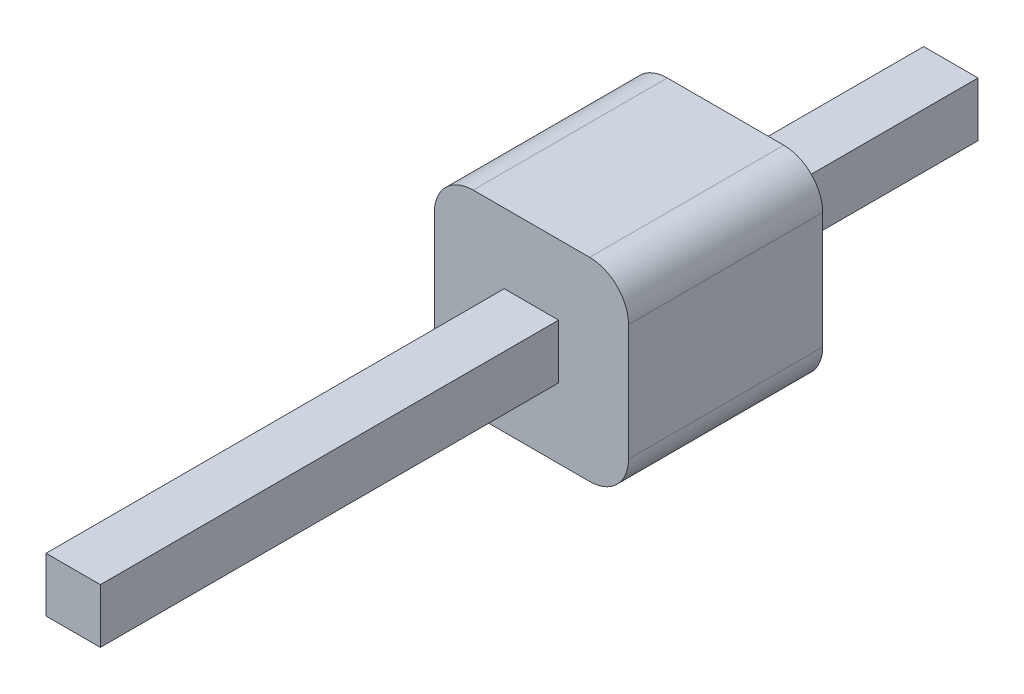
ISO-10303-21;
HEADER;
FILE_DESCRIPTION(('STEP AP214'),'2;1');
FILE_NAME('part.step','',(''),(''),'','','');
FILE_SCHEMA(('AUTOMOTIVE_DESIGN { 1 0 10303 214 1 1 1 1 }'));
ENDSEC;
DATA;
#1=APPLICATION_CONTEXT('core data for automotive mechanical design processes');
#2=APPLICATION_PROTOCOL_DEFINITION('international standard','automotive_design',2000,#1);
#3=PRODUCT_CONTEXT('',#1,'mechanical');
#4=PRODUCT('Part','Part','',(#3));
#5=PRODUCT_RELATED_PRODUCT_CATEGORY('part','',(#4));
#6=PRODUCT_DEFINITION_FORMATION('','',#4);
#7=PRODUCT_DEFINITION_CONTEXT('part definition',#1,'design');
#8=PRODUCT_DEFINITION('design','',#6,#7);
#9=PRODUCT_DEFINITION_SHAPE('','',#8);
#10=(LENGTH_UNIT() NAMED_UNIT(*) SI_UNIT(.MILLI.,.METRE.));
#11=(NAMED_UNIT(*) PLANE_ANGLE_UNIT() SI_UNIT($,.RADIAN.));
#12=(NAMED_UNIT(*) SI_UNIT($,.STERADIAN.) SOLID_ANGLE_UNIT());
#13=UNCERTAINTY_MEASURE_WITH_UNIT(LENGTH_MEASURE(1.E-05),#10,'distance_accuracy_value','');
#14=(GEOMETRIC_REPRESENTATION_CONTEXT(3) GLOBAL_UNCERTAINTY_ASSIGNED_CONTEXT((#13)) GLOBAL_UNIT_ASSIGNED_CONTEXT((#10,
#11,#12)) REPRESENTATION_CONTEXT('',''));
#15=CARTESIAN_POINT('',(0.,0.,0.));
#16=DIRECTION('',(0.,0.,1.));
#17=DIRECTION('',(1.,0.,0.));
#18=AXIS2_PLACEMENT_3D('',#15,#16,#17);
#19=CARTESIAN_POINT('',(-0.35,-0.35,11.3));
#20=DIRECTION('',(1.,0.,0.));
#21=DIRECTION('',(0.,0.,-1.));
#22=AXIS2_PLACEMENT_3D('',#19,#20,#21);
#23=PLANE('',#22);
#24=DIRECTION('',(0.,1.,0.));
#25=VECTOR('',#24,1.);
#26=CARTESIAN_POINT('',(-0.35,-0.35,5.4));
#27=LINE('',#26,#25);
#28=CARTESIAN_POINT('',(-0.35,-0.35,5.4));
#29=VERTEX_POINT('',#28);
#30=CARTESIAN_POINT('',(-0.35,0.35,5.4));
#31=VERTEX_POINT('',#30);
#32=EDGE_CURVE('E259',#29,#31,#27,.T.);
#33=ORIENTED_EDGE('',*,*,#32,.F.);
#34=DIRECTION('',(0.,0.,-1.));
#35=VECTOR('',#34,1.);
#36=CARTESIAN_POINT('',(-0.35,-0.35,11.3));
#37=LINE('',#36,#35);
#38=CARTESIAN_POINT('',(-0.35,-0.35,11.3));
#39=VERTEX_POINT('',#38);
#40=EDGE_CURVE('E160',#39,#29,#37,.T.);
#41=ORIENTED_EDGE('',*,*,#40,.F.);
#42=DIRECTION('',(0.,-1.,0.));
#43=VECTOR('',#42,1.);
#44=CARTESIAN_POINT('',(-0.35,-0.35,11.3));
#45=LINE('',#44,#43);
#46=CARTESIAN_POINT('',(-0.35,0.35,11.3));
#47=VERTEX_POINT('',#46);
#48=EDGE_CURVE('E263',#47,#39,#45,.T.);
#49=ORIENTED_EDGE('',*,*,#48,.F.);
#50=DIRECTION('',(0.,0.,-1.));
#51=VECTOR('',#50,1.);
#52=CARTESIAN_POINT('',(-0.35,0.35,11.3));
#53=LINE('',#52,#51);
#54=EDGE_CURVE('E176',#47,#31,#53,.T.);
#55=ORIENTED_EDGE('',*,*,#54,.T.);
#56=EDGE_LOOP('',(#33,#41,#49,#55));
#57=FACE_BOUND('',#56,.T.);
#58=ADVANCED_FACE('F36',(#57),#23,.F.);
#59=CARTESIAN_POINT('',(0.35,-0.35,11.3));
#60=DIRECTION('',(0.,1.,0.));
#61=DIRECTION('',(-1.,0.,0.));
#62=AXIS2_PLACEMENT_3D('',#59,#60,#61);
#63=PLANE('',#62);
#64=DIRECTION('',(-1.,0.,0.));
#65=VECTOR('',#64,1.);
#66=CARTESIAN_POINT('',(0.35,-0.35,5.4));
#67=LINE('',#66,#65);
#68=CARTESIAN_POINT('',(0.35,-0.35,5.4));
#69=VERTEX_POINT('',#68);
#70=EDGE_CURVE('E256',#69,#29,#67,.T.);
#71=ORIENTED_EDGE('',*,*,#70,.F.);
#72=DIRECTION('',(0.,0.,-1.));
#73=VECTOR('',#72,1.);
#74=CARTESIAN_POINT('',(0.35,-0.35,11.3));
#75=LINE('',#74,#73);
#76=CARTESIAN_POINT('',(0.35,-0.35,11.3));
#77=VERTEX_POINT('',#76);
#78=EDGE_CURVE('E189',#77,#69,#75,.T.);
#79=ORIENTED_EDGE('',*,*,#78,.F.);
#80=DIRECTION('',(1.,0.,0.));
#81=VECTOR('',#80,1.);
#82=CARTESIAN_POINT('',(0.35,-0.35,11.3));
#83=LINE('',#82,#81);
#84=EDGE_CURVE('E266',#39,#77,#83,.T.);
#85=ORIENTED_EDGE('',*,*,#84,.F.);
#86=ORIENTED_EDGE('',*,*,#40,.T.);
#87=EDGE_LOOP('',(#71,#79,#85,#86));
#88=FACE_BOUND('',#87,.T.);
#89=ADVANCED_FACE('F285',(#88),#63,.F.);
#90=CARTESIAN_POINT('',(0.35,-0.35,11.3));
#91=DIRECTION('',(-1.,0.,0.));
#92=DIRECTION('',(0.,0.,1.));
#93=AXIS2_PLACEMENT_3D('',#90,#91,#92);
#94=PLANE('',#93);
#95=DIRECTION('',(0.,-1.,0.));
#96=VECTOR('',#95,1.);
#97=CARTESIAN_POINT('',(0.35,-0.35,5.4));
#98=LINE('',#97,#96);
#99=CARTESIAN_POINT('',(0.35,0.35,5.4));
#100=VERTEX_POINT('',#99);
#101=EDGE_CURVE('E169',#100,#69,#98,.T.);
#102=ORIENTED_EDGE('',*,*,#101,.F.);
#103=DIRECTION('',(0.,0.,-1.));
#104=VECTOR('',#103,1.);
#105=CARTESIAN_POINT('',(0.35,0.35,11.3));
#106=LINE('',#105,#104);
#107=CARTESIAN_POINT('',(0.35,0.35,11.3));
#108=VERTEX_POINT('',#107);
#109=EDGE_CURVE('E186',#108,#100,#106,.T.);
#110=ORIENTED_EDGE('',*,*,#109,.F.);
#111=DIRECTION('',(0.,1.,0.));
#112=VECTOR('',#111,1.);
#113=CARTESIAN_POINT('',(0.35,-0.35,11.3));
#114=LINE('',#113,#112);
#115=EDGE_CURVE('E181',#77,#108,#114,.T.);
#116=ORIENTED_EDGE('',*,*,#115,.F.);
#117=ORIENTED_EDGE('',*,*,#78,.T.);
#118=EDGE_LOOP('',(#102,#110,#116,#117));
#119=FACE_BOUND('',#118,.T.);
#120=ADVANCED_FACE('F293',(#119),#94,.F.);
#121=CARTESIAN_POINT('',(0.35,0.35,11.3));
#122=DIRECTION('',(0.,-1.,0.));
#123=DIRECTION('',(1.,0.,0.));
#124=AXIS2_PLACEMENT_3D('',#121,#122,#123);
#125=PLANE('',#124);
#126=DIRECTION('',(1.,0.,0.));
#127=VECTOR('',#126,1.);
#128=CARTESIAN_POINT('',(0.35,0.35,5.4));
#129=LINE('',#128,#127);
#130=EDGE_CURVE('E159',#31,#100,#129,.T.);
#131=ORIENTED_EDGE('',*,*,#130,.F.);
#132=ORIENTED_EDGE('',*,*,#54,.F.);
#133=DIRECTION('',(-1.,0.,0.));
#134=VECTOR('',#133,1.);
#135=CARTESIAN_POINT('',(0.35,0.35,11.3));
#136=LINE('',#135,#134);
#137=EDGE_CURVE('E177',#108,#47,#136,.T.);
#138=ORIENTED_EDGE('',*,*,#137,.F.);
#139=ORIENTED_EDGE('',*,*,#109,.T.);
#140=EDGE_LOOP('',(#131,#132,#138,#139));
#141=FACE_BOUND('',#140,.T.);
#142=ADVANCED_FACE('F350',(#141),#125,.F.);
#143=CARTESIAN_POINT('',(0.,0.,11.3));
#144=DIRECTION('',(0.,0.,1.));
#145=DIRECTION('',(1.,0.,0.));
#146=AXIS2_PLACEMENT_3D('',#143,#144,#145);
#147=PLANE('',#146);
#148=ORIENTED_EDGE('',*,*,#48,.T.);
#149=ORIENTED_EDGE('',*,*,#84,.T.);
#150=ORIENTED_EDGE('',*,*,#115,.T.);
#151=ORIENTED_EDGE('',*,*,#137,.T.);
#152=EDGE_LOOP('',(#148,#149,#150,#151));
#153=FACE_BOUND('',#152,.T.);
#154=ADVANCED_FACE('F337',(#153),#147,.T.);
#155=CARTESIAN_POINT('',(0.,0.,5.4));
#156=DIRECTION('',(0.,0.,-1.));
#157=DIRECTION('',(-1.,0.,0.));
#158=AXIS2_PLACEMENT_3D('',#155,#156,#157);
#159=PLANE('',#158);
#160=DIRECTION('',(0.,1.,0.));
#161=VECTOR('',#160,1.);
#162=CARTESIAN_POINT('',(-1.25,-1.25,5.4));
#163=LINE('',#162,#161);
#164=CARTESIAN_POINT('',(-1.25,-0.75,5.4));
#165=VERTEX_POINT('',#164);
#166=CARTESIAN_POINT('',(-1.25,0.75,5.4));
#167=VERTEX_POINT('',#166);
#168=EDGE_CURVE('E323',#165,#167,#163,.T.);
#169=ORIENTED_EDGE('',*,*,#168,.F.);
#170=CARTESIAN_POINT('',(-0.75,-0.75,5.4));
#171=DIRECTION('',(0.,0.,-1.));
#172=DIRECTION('',(-1.,0.,0.));
#173=AXIS2_PLACEMENT_3D('',#170,#171,#172);
#174=CIRCLE('',#173,0.5);
#175=CARTESIAN_POINT('',(-0.75,-1.25,5.4));
#176=VERTEX_POINT('',#175);
#177=EDGE_CURVE('E219',#165,#176,#174,.F.);
#178=ORIENTED_EDGE('',*,*,#177,.T.);
#179=DIRECTION('',(-1.,0.,0.));
#180=VECTOR('',#179,1.);
#181=CARTESIAN_POINT('',(-1.25,-1.25,5.4));
#182=LINE('',#181,#180);
#183=CARTESIAN_POINT('',(0.75,-1.25,5.4));
#184=VERTEX_POINT('',#183);
#185=EDGE_CURVE('E325',#184,#176,#182,.T.);
#186=ORIENTED_EDGE('',*,*,#185,.F.);
#187=CARTESIAN_POINT('',(0.75,-0.75,5.4));
#188=DIRECTION('',(0.,0.,-1.));
#189=DIRECTION('',(-1.,0.,0.));
#190=AXIS2_PLACEMENT_3D('',#187,#188,#189);
#191=CIRCLE('',#190,0.5);
#192=CARTESIAN_POINT('',(1.25,-0.75,5.4));
#193=VERTEX_POINT('',#192);
#194=EDGE_CURVE('E214',#184,#193,#191,.F.);
#195=ORIENTED_EDGE('',*,*,#194,.T.);
#196=DIRECTION('',(0.,-1.,0.));
#197=VECTOR('',#196,1.);
#198=CARTESIAN_POINT('',(1.25,-1.25,5.4));
#199=LINE('',#198,#197);
#200=CARTESIAN_POINT('',(1.25,0.75,5.4));
#201=VERTEX_POINT('',#200);
#202=EDGE_CURVE('E233',#201,#193,#199,.T.);
#203=ORIENTED_EDGE('',*,*,#202,.F.);
#204=CARTESIAN_POINT('',(0.75,0.75,5.4));
#205=DIRECTION('',(0.,0.,-1.));
#206=DIRECTION('',(-1.,0.,0.));
#207=AXIS2_PLACEMENT_3D('',#204,#205,#206);
#208=CIRCLE('',#207,0.5);
#209=CARTESIAN_POINT('',(0.75,1.25,5.4));
#210=VERTEX_POINT('',#209);
#211=EDGE_CURVE('E51',#201,#210,#208,.F.);
#212=ORIENTED_EDGE('',*,*,#211,.T.);
#213=DIRECTION('',(1.,0.,0.));
#214=VECTOR('',#213,1.);
#215=CARTESIAN_POINT('',(-1.25,1.25,5.4));
#216=LINE('',#215,#214);
#217=CARTESIAN_POINT('',(-0.75,1.25,5.4));
#218=VERTEX_POINT('',#217);
#219=EDGE_CURVE('E245',#218,#210,#216,.T.);
#220=ORIENTED_EDGE('',*,*,#219,.F.);
#221=CARTESIAN_POINT('',(-0.75,0.75,5.4));
#222=DIRECTION('',(0.,0.,-1.));
#223=DIRECTION('',(-1.,0.,0.));
#224=AXIS2_PLACEMENT_3D('',#221,#222,#223);
#225=CIRCLE('',#224,0.5);
#226=EDGE_CURVE('E217',#218,#167,#225,.F.);
#227=ORIENTED_EDGE('',*,*,#226,.T.);
#228=EDGE_LOOP('',(#169,#178,#186,#195,#203,#212,#220,#227));
#229=FACE_BOUND('',#228,.T.);
#230=ORIENTED_EDGE('',*,*,#70,.T.);
#231=ORIENTED_EDGE('',*,*,#32,.T.);
#232=ORIENTED_EDGE('',*,*,#130,.T.);
#233=ORIENTED_EDGE('',*,*,#101,.T.);
#234=EDGE_LOOP('',(#230,#231,#232,#233));
#235=FACE_BOUND('',#234,.T.);
#236=ADVANCED_FACE('F334',(#229,#235),#159,.F.);
#237=CARTESIAN_POINT('',(0.,0.,2.9));
#238=DIRECTION('',(0.,0.,-1.));
#239=DIRECTION('',(-1.,0.,0.));
#240=AXIS2_PLACEMENT_3D('',#237,#238,#239);
#241=PLANE('',#240);
#242=DIRECTION('',(-1.,0.,0.));
#243=VECTOR('',#242,1.);
#244=CARTESIAN_POINT('',(-1.25,-1.25,2.9));
#245=LINE('',#244,#243);
#246=CARTESIAN_POINT('',(0.75,-1.25,2.9));
#247=VERTEX_POINT('',#246);
#248=CARTESIAN_POINT('',(-0.75,-1.25,2.9));
#249=VERTEX_POINT('',#248);
#250=EDGE_CURVE('E240',#247,#249,#245,.T.);
#251=ORIENTED_EDGE('',*,*,#250,.T.);
#252=CARTESIAN_POINT('',(-0.75,-0.75,2.9));
#253=DIRECTION('',(0.,0.,-1.));
#254=DIRECTION('',(-1.,0.,0.));
#255=AXIS2_PLACEMENT_3D('',#252,#253,#254);
#256=CIRCLE('',#255,0.5);
#257=CARTESIAN_POINT('',(-1.25,-0.75,2.9));
#258=VERTEX_POINT('',#257);
#259=EDGE_CURVE('E207',#249,#258,#256,.T.);
#260=ORIENTED_EDGE('',*,*,#259,.T.);
#261=DIRECTION('',(0.,1.,0.));
#262=VECTOR('',#261,1.);
#263=CARTESIAN_POINT('',(-1.25,-1.25,2.9));
#264=LINE('',#263,#262);
#265=CARTESIAN_POINT('',(-1.25,0.75,2.9));
#266=VERTEX_POINT('',#265);
#267=EDGE_CURVE('E242',#258,#266,#264,.T.);
#268=ORIENTED_EDGE('',*,*,#267,.T.);
#269=CARTESIAN_POINT('',(-0.75,0.75,2.9));
#270=DIRECTION('',(0.,0.,-1.));
#271=DIRECTION('',(-1.,0.,0.));
#272=AXIS2_PLACEMENT_3D('',#269,#270,#271);
#273=CIRCLE('',#272,0.5);
#274=CARTESIAN_POINT('',(-0.75,1.25,2.9));
#275=VERTEX_POINT('',#274);
#276=EDGE_CURVE('E205',#266,#275,#273,.T.);
#277=ORIENTED_EDGE('',*,*,#276,.T.);
#278=DIRECTION('',(1.,0.,0.));
#279=VECTOR('',#278,1.);
#280=CARTESIAN_POINT('',(-1.25,1.25,2.9));
#281=LINE('',#280,#279);
#282=CARTESIAN_POINT('',(0.75,1.25,2.9));
#283=VERTEX_POINT('',#282);
#284=EDGE_CURVE('E250',#275,#283,#281,.T.);
#285=ORIENTED_EDGE('',*,*,#284,.T.);
#286=CARTESIAN_POINT('',(0.75,0.75,2.9));
#287=DIRECTION('',(0.,0.,-1.));
#288=DIRECTION('',(-1.,0.,0.));
#289=AXIS2_PLACEMENT_3D('',#286,#287,#288);
#290=CIRCLE('',#289,0.5);
#291=CARTESIAN_POINT('',(1.25,0.75,2.9));
#292=VERTEX_POINT('',#291);
#293=EDGE_CURVE('E203',#283,#292,#290,.T.);
#294=ORIENTED_EDGE('',*,*,#293,.T.);
#295=DIRECTION('',(0.,-1.,0.));
#296=VECTOR('',#295,1.);
#297=CARTESIAN_POINT('',(1.25,-1.25,2.9));
#298=LINE('',#297,#296);
#299=CARTESIAN_POINT('',(1.25,-0.75,2.9));
#300=VERTEX_POINT('',#299);
#301=EDGE_CURVE('E231',#292,#300,#298,.T.);
#302=ORIENTED_EDGE('',*,*,#301,.T.);
#303=CARTESIAN_POINT('',(0.75,-0.75,2.9));
#304=DIRECTION('',(0.,0.,-1.));
#305=DIRECTION('',(-1.,0.,0.));
#306=AXIS2_PLACEMENT_3D('',#303,#304,#305);
#307=CIRCLE('',#306,0.5);
#308=EDGE_CURVE('E201',#300,#247,#307,.T.);
#309=ORIENTED_EDGE('',*,*,#308,.T.);
#310=EDGE_LOOP('',(#251,#260,#268,#277,#285,#294,#302,#309));
#311=FACE_BOUND('',#310,.T.);
#312=DIRECTION('',(0.,1.,0.));
#313=VECTOR('',#312,1.);
#314=CARTESIAN_POINT('',(-0.35,-0.35,2.9));
#315=LINE('',#314,#313);
#316=CARTESIAN_POINT('',(-0.35,-0.35,2.9));
#317=VERTEX_POINT('',#316);
#318=CARTESIAN_POINT('',(-0.35,0.35,2.9));
#319=VERTEX_POINT('',#318);
#320=EDGE_CURVE('E152',#317,#319,#315,.T.);
#321=ORIENTED_EDGE('',*,*,#320,.F.);
#322=DIRECTION('',(-1.,0.,0.));
#323=VECTOR('',#322,1.);
#324=CARTESIAN_POINT('',(0.35,-0.35,2.9));
#325=LINE('',#324,#323);
#326=CARTESIAN_POINT('',(0.35,-0.35,2.9));
#327=VERTEX_POINT('',#326);
#328=EDGE_CURVE('E170',#327,#317,#325,.T.);
#329=ORIENTED_EDGE('',*,*,#328,.F.);
#330=DIRECTION('',(0.,-1.,0.));
#331=VECTOR('',#330,1.);
#332=CARTESIAN_POINT('',(0.35,-0.35,2.9));
#333=LINE('',#332,#331);
#334=CARTESIAN_POINT('',(0.35,0.35,2.9));
#335=VERTEX_POINT('',#334);
#336=EDGE_CURVE('E155',#335,#327,#333,.T.);
#337=ORIENTED_EDGE('',*,*,#336,.F.);
#338=DIRECTION('',(1.,0.,0.));
#339=VECTOR('',#338,1.);
#340=CARTESIAN_POINT('',(0.35,0.35,2.9));
#341=LINE('',#340,#339);
#342=EDGE_CURVE('E149',#319,#335,#341,.T.);
#343=ORIENTED_EDGE('',*,*,#342,.F.);
#344=EDGE_LOOP('',(#321,#329,#337,#343));
#345=FACE_BOUND('',#344,.T.);
#346=ADVANCED_FACE('F151',(#311,#345),#241,.T.);
#347=CARTESIAN_POINT('',(1.25,-1.25,5.4));
#348=DIRECTION('',(1.,0.,0.));
#349=DIRECTION('',(0.,0.,-1.));
#350=AXIS2_PLACEMENT_3D('',#347,#348,#349);
#351=PLANE('',#350);
#352=ORIENTED_EDGE('',*,*,#301,.F.);
#353=DIRECTION('',(0.,0.,-1.));
#354=VECTOR('',#353,1.);
#355=CARTESIAN_POINT('',(1.25,0.75,5.4));
#356=LINE('',#355,#354);
#357=EDGE_CURVE('E11',#292,#201,#356,.F.);
#358=ORIENTED_EDGE('',*,*,#357,.T.);
#359=ORIENTED_EDGE('',*,*,#202,.T.);
#360=DIRECTION('',(0.,0.,-1.));
#361=VECTOR('',#360,1.);
#362=CARTESIAN_POINT('',(1.25,-0.75,5.4));
#363=LINE('',#362,#361);
#364=EDGE_CURVE('E44',#193,#300,#363,.T.);
#365=ORIENTED_EDGE('',*,*,#364,.T.);
#366=EDGE_LOOP('',(#352,#358,#359,#365));
#367=FACE_BOUND('',#366,.T.);
#368=ADVANCED_FACE('F230',(#367),#351,.T.);
#369=CARTESIAN_POINT('',(-1.25,1.25,5.4));
#370=DIRECTION('',(0.,1.,0.));
#371=DIRECTION('',(0.,0.,1.));
#372=AXIS2_PLACEMENT_3D('',#369,#370,#371);
#373=PLANE('',#372);
#374=ORIENTED_EDGE('',*,*,#284,.F.);
#375=DIRECTION('',(0.,0.,-1.));
#376=VECTOR('',#375,1.);
#377=CARTESIAN_POINT('',(-0.75,1.25,5.4));
#378=LINE('',#377,#376);
#379=EDGE_CURVE('E58',#275,#218,#378,.F.);
#380=ORIENTED_EDGE('',*,*,#379,.T.);
#381=ORIENTED_EDGE('',*,*,#219,.T.);
#382=DIRECTION('',(0.,0.,-1.));
#383=VECTOR('',#382,1.);
#384=CARTESIAN_POINT('',(0.75,1.25,5.4));
#385=LINE('',#384,#383);
#386=EDGE_CURVE('E221',#210,#283,#385,.T.);
#387=ORIENTED_EDGE('',*,*,#386,.T.);
#388=EDGE_LOOP('',(#374,#380,#381,#387));
#389=FACE_BOUND('',#388,.T.);
#390=ADVANCED_FACE('F314',(#389),#373,.T.);
#391=CARTESIAN_POINT('',(-1.25,-1.25,5.4));
#392=DIRECTION('',(-1.,0.,0.));
#393=DIRECTION('',(0.,0.,1.));
#394=AXIS2_PLACEMENT_3D('',#391,#392,#393);
#395=PLANE('',#394);
#396=ORIENTED_EDGE('',*,*,#267,.F.);
#397=DIRECTION('',(0.,0.,-1.));
#398=VECTOR('',#397,1.);
#399=CARTESIAN_POINT('',(-1.25,-0.75,5.4));
#400=LINE('',#399,#398);
#401=EDGE_CURVE('E212',#258,#165,#400,.F.);
#402=ORIENTED_EDGE('',*,*,#401,.T.);
#403=ORIENTED_EDGE('',*,*,#168,.T.);
#404=DIRECTION('',(0.,0.,-1.));
#405=VECTOR('',#404,1.);
#406=CARTESIAN_POINT('',(-1.25,0.75,5.4));
#407=LINE('',#406,#405);
#408=EDGE_CURVE('E209',#167,#266,#407,.T.);
#409=ORIENTED_EDGE('',*,*,#408,.T.);
#410=EDGE_LOOP('',(#396,#402,#403,#409));
#411=FACE_BOUND('',#410,.T.);
#412=ADVANCED_FACE('F320',(#411),#395,.T.);
#413=CARTESIAN_POINT('',(-1.25,-1.25,5.4));
#414=DIRECTION('',(0.,-1.,0.));
#415=DIRECTION('',(1.,0.,0.));
#416=AXIS2_PLACEMENT_3D('',#413,#414,#415);
#417=PLANE('',#416);
#418=ORIENTED_EDGE('',*,*,#185,.T.);
#419=DIRECTION('',(0.,0.,-1.));
#420=VECTOR('',#419,1.);
#421=CARTESIAN_POINT('',(-0.75,-1.25,5.4));
#422=LINE('',#421,#420);
#423=EDGE_CURVE('E198',#176,#249,#422,.T.);
#424=ORIENTED_EDGE('',*,*,#423,.T.);
#425=ORIENTED_EDGE('',*,*,#250,.F.);
#426=DIRECTION('',(0.,0.,-1.));
#427=VECTOR('',#426,1.);
#428=CARTESIAN_POINT('',(0.75,-1.25,5.4));
#429=LINE('',#428,#427);
#430=EDGE_CURVE('E196',#247,#184,#429,.F.);
#431=ORIENTED_EDGE('',*,*,#430,.T.);
#432=EDGE_LOOP('',(#418,#424,#425,#431));
#433=FACE_BOUND('',#432,.T.);
#434=ADVANCED_FACE('F332',(#433),#417,.T.);
#435=CARTESIAN_POINT('',(0.,0.,0.));
#436=DIRECTION('',(0.,0.,1.));
#437=DIRECTION('',(1.,0.,0.));
#438=AXIS2_PLACEMENT_3D('',#435,#436,#437);
#439=PLANE('',#438);
#440=DIRECTION('',(0.,-1.,0.));
#441=VECTOR('',#440,1.);
#442=CARTESIAN_POINT('',(-0.35,-0.35,0.));
#443=LINE('',#442,#441);
#444=CARTESIAN_POINT('',(-0.35,0.35,0.));
#445=VERTEX_POINT('',#444);
#446=CARTESIAN_POINT('',(-0.35,-0.35,0.));
#447=VERTEX_POINT('',#446);
#448=EDGE_CURVE('E262',#445,#447,#443,.T.);
#449=ORIENTED_EDGE('',*,*,#448,.F.);
#450=DIRECTION('',(-1.,0.,0.));
#451=VECTOR('',#450,1.);
#452=CARTESIAN_POINT('',(0.35,0.35,0.));
#453=LINE('',#452,#451);
#454=CARTESIAN_POINT('',(0.35,0.35,0.));
#455=VERTEX_POINT('',#454);
#456=EDGE_CURVE('E174',#455,#445,#453,.T.);
#457=ORIENTED_EDGE('',*,*,#456,.F.);
#458=DIRECTION('',(0.,1.,0.));
#459=VECTOR('',#458,1.);
#460=CARTESIAN_POINT('',(0.35,-0.35,0.));
#461=LINE('',#460,#459);
#462=CARTESIAN_POINT('',(0.35,-0.35,0.));
#463=VERTEX_POINT('',#462);
#464=EDGE_CURVE('E272',#463,#455,#461,.T.);
#465=ORIENTED_EDGE('',*,*,#464,.F.);
#466=DIRECTION('',(1.,0.,0.));
#467=VECTOR('',#466,1.);
#468=CARTESIAN_POINT('',(0.35,-0.35,0.));
#469=LINE('',#468,#467);
#470=EDGE_CURVE('E270',#447,#463,#469,.T.);
#471=ORIENTED_EDGE('',*,*,#470,.F.);
#472=EDGE_LOOP('',(#449,#457,#465,#471));
#473=FACE_BOUND('',#472,.T.);
#474=ADVANCED_FACE('F280',(#473),#439,.F.);
#475=EDGE_CURVE('E166',#319,#445,#53,.T.);
#476=ORIENTED_EDGE('',*,*,#475,.F.);
#477=ORIENTED_EDGE('',*,*,#342,.T.);
#478=EDGE_CURVE('E180',#335,#455,#106,.T.);
#479=ORIENTED_EDGE('',*,*,#478,.T.);
#480=ORIENTED_EDGE('',*,*,#456,.T.);
#481=EDGE_LOOP('',(#476,#477,#479,#480));
#482=FACE_BOUND('',#481,.T.);
#483=ADVANCED_FACE('F172',(#482),#125,.F.);
#484=ORIENTED_EDGE('',*,*,#478,.F.);
#485=ORIENTED_EDGE('',*,*,#336,.T.);
#486=EDGE_CURVE('E188',#327,#463,#75,.T.);
#487=ORIENTED_EDGE('',*,*,#486,.T.);
#488=ORIENTED_EDGE('',*,*,#464,.T.);
#489=EDGE_LOOP('',(#484,#485,#487,#488));
#490=FACE_BOUND('',#489,.T.);
#491=ADVANCED_FACE('F276',(#490),#94,.F.);
#492=ORIENTED_EDGE('',*,*,#486,.F.);
#493=ORIENTED_EDGE('',*,*,#328,.T.);
#494=EDGE_CURVE('E168',#317,#447,#37,.T.);
#495=ORIENTED_EDGE('',*,*,#494,.T.);
#496=ORIENTED_EDGE('',*,*,#470,.T.);
#497=EDGE_LOOP('',(#492,#493,#495,#496));
#498=FACE_BOUND('',#497,.T.);
#499=ADVANCED_FACE('F282',(#498),#63,.F.);
#500=ORIENTED_EDGE('',*,*,#494,.F.);
#501=ORIENTED_EDGE('',*,*,#320,.T.);
#502=ORIENTED_EDGE('',*,*,#475,.T.);
#503=ORIENTED_EDGE('',*,*,#448,.T.);
#504=EDGE_LOOP('',(#500,#501,#502,#503));
#505=FACE_BOUND('',#504,.T.);
#506=ADVANCED_FACE('F164',(#505),#23,.F.);
#507=CARTESIAN_POINT('',(-0.75,-0.75,5.4));
#508=DIRECTION('',(0.,0.,-1.));
#509=DIRECTION('',(-1.,0.,0.));
#510=AXIS2_PLACEMENT_3D('',#507,#508,#509);
#511=CYLINDRICAL_SURFACE('',#510,0.5);
#512=ORIENTED_EDGE('',*,*,#177,.F.);
#513=ORIENTED_EDGE('',*,*,#401,.F.);
#514=ORIENTED_EDGE('',*,*,#259,.F.);
#515=ORIENTED_EDGE('',*,*,#423,.F.);
#516=EDGE_LOOP('',(#512,#513,#514,#515));
#517=FACE_BOUND('',#516,.T.);
#518=ADVANCED_FACE('F290',(#517),#511,.T.);
#519=CARTESIAN_POINT('',(-0.75,0.75,5.4));
#520=DIRECTION('',(0.,0.,-1.));
#521=DIRECTION('',(-1.,0.,0.));
#522=AXIS2_PLACEMENT_3D('',#519,#520,#521);
#523=CYLINDRICAL_SURFACE('',#522,0.5);
#524=ORIENTED_EDGE('',*,*,#226,.F.);
#525=ORIENTED_EDGE('',*,*,#379,.F.);
#526=ORIENTED_EDGE('',*,*,#276,.F.);
#527=ORIENTED_EDGE('',*,*,#408,.F.);
#528=EDGE_LOOP('',(#524,#525,#526,#527));
#529=FACE_BOUND('',#528,.T.);
#530=ADVANCED_FACE('F303',(#529),#523,.T.);
#531=CARTESIAN_POINT('',(0.75,0.75,5.4));
#532=DIRECTION('',(0.,0.,-1.));
#533=DIRECTION('',(-1.,0.,0.));
#534=AXIS2_PLACEMENT_3D('',#531,#532,#533);
#535=CYLINDRICAL_SURFACE('',#534,0.5);
#536=ORIENTED_EDGE('',*,*,#211,.F.);
#537=ORIENTED_EDGE('',*,*,#357,.F.);
#538=ORIENTED_EDGE('',*,*,#293,.F.);
#539=ORIENTED_EDGE('',*,*,#386,.F.);
#540=EDGE_LOOP('',(#536,#537,#538,#539));
#541=FACE_BOUND('',#540,.T.);
#542=ADVANCED_FACE('F306',(#541),#535,.T.);
#543=CARTESIAN_POINT('',(0.75,-0.75,5.4));
#544=DIRECTION('',(0.,0.,-1.));
#545=DIRECTION('',(-1.,0.,0.));
#546=AXIS2_PLACEMENT_3D('',#543,#544,#545);
#547=CYLINDRICAL_SURFACE('',#546,0.5);
#548=ORIENTED_EDGE('',*,*,#194,.F.);
#549=ORIENTED_EDGE('',*,*,#430,.F.);
#550=ORIENTED_EDGE('',*,*,#308,.F.);
#551=ORIENTED_EDGE('',*,*,#364,.F.);
#552=EDGE_LOOP('',(#548,#549,#550,#551));
#553=FACE_BOUND('',#552,.T.);
#554=ADVANCED_FACE('F38',(#553),#547,.T.);
#555=CLOSED_SHELL('',(#58,#89,#120,#142,#154,#236,#346,#368,#390,#412,#434,#474,#483,#491,#499,
#506,#518,#530,#542,#554));
#556=MANIFOLD_SOLID_BREP('B2',#555);
#557=ADVANCED_BREP_SHAPE_REPRESENTATION('',(#18,#556),#14);
#558=SHAPE_DEFINITION_REPRESENTATION(#9,#557);
ENDSEC;
END-ISO-10303-21;
